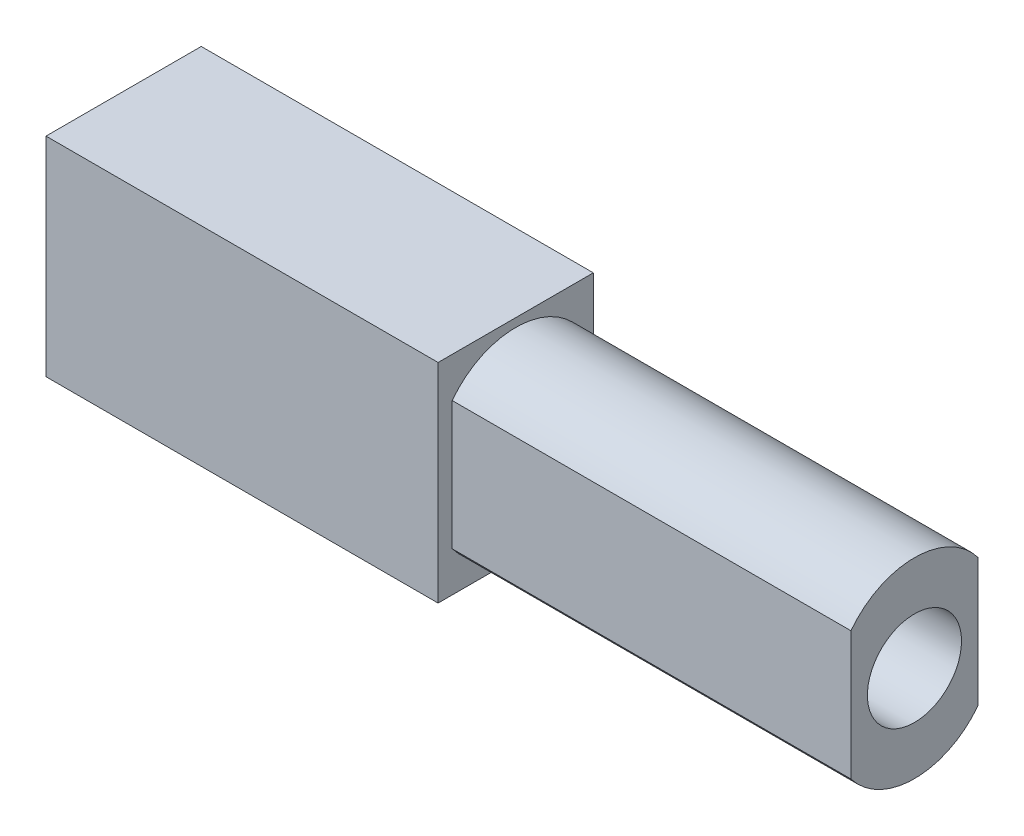
ISO-10303-21;
HEADER;
FILE_DESCRIPTION(('STEP AP214'),'2;1');
FILE_NAME('part.step','',(''),(''),'','','');
FILE_SCHEMA(('AUTOMOTIVE_DESIGN { 1 0 10303 214 1 1 1 1 }'));
ENDSEC;
DATA;
#1=APPLICATION_CONTEXT('core data for automotive mechanical design processes');
#2=APPLICATION_PROTOCOL_DEFINITION('international standard','automotive_design',2000,#1);
#3=PRODUCT_CONTEXT('',#1,'mechanical');
#4=PRODUCT('Part','Part','',(#3));
#5=PRODUCT_RELATED_PRODUCT_CATEGORY('part','',(#4));
#6=PRODUCT_DEFINITION_FORMATION('','',#4);
#7=PRODUCT_DEFINITION_CONTEXT('part definition',#1,'design');
#8=PRODUCT_DEFINITION('design','',#6,#7);
#9=PRODUCT_DEFINITION_SHAPE('','',#8);
#10=(LENGTH_UNIT() NAMED_UNIT(*) SI_UNIT(.MILLI.,.METRE.));
#11=(NAMED_UNIT(*) PLANE_ANGLE_UNIT() SI_UNIT($,.RADIAN.));
#12=(NAMED_UNIT(*) SI_UNIT($,.STERADIAN.) SOLID_ANGLE_UNIT());
#13=UNCERTAINTY_MEASURE_WITH_UNIT(LENGTH_MEASURE(1.E-05),#10,'distance_accuracy_value','');
#14=(GEOMETRIC_REPRESENTATION_CONTEXT(3) GLOBAL_UNCERTAINTY_ASSIGNED_CONTEXT((#13)) GLOBAL_UNIT_ASSIGNED_CONTEXT((#10,
#11,#12)) REPRESENTATION_CONTEXT('',''));
#15=CARTESIAN_POINT('',(0.,0.,0.));
#16=DIRECTION('',(0.,0.,1.));
#17=DIRECTION('',(1.,0.,0.));
#18=AXIS2_PLACEMENT_3D('',#15,#16,#17);
#19=CARTESIAN_POINT('',(38.1,6.1341,6.0706));
#20=DIRECTION('',(0.,0.,-1.));
#21=DIRECTION('',(0.,1.,0.));
#22=AXIS2_PLACEMENT_3D('',#19,#20,#21);
#23=PLANE('',#22);
#24=DIRECTION('',(0.,-1.,0.));
#25=VECTOR('',#24,1.);
#26=CARTESIAN_POINT('',(0.,6.1341,6.0706));
#27=LINE('',#26,#25);
#28=CARTESIAN_POINT('',(0.,6.1341,6.0706));
#29=VERTEX_POINT('',#28);
#30=CARTESIAN_POINT('',(0.,-6.1341,6.0706));
#31=VERTEX_POINT('',#30);
#32=EDGE_CURVE('E129',#29,#31,#27,.T.);
#33=ORIENTED_EDGE('',*,*,#32,.T.);
#34=DIRECTION('',(-1.,0.,0.));
#35=VECTOR('',#34,1.);
#36=CARTESIAN_POINT('',(38.1,-6.1341,6.0706));
#37=LINE('',#36,#35);
#38=CARTESIAN_POINT('',(38.1,-6.1341,6.0706));
#39=VERTEX_POINT('',#38);
#40=EDGE_CURVE('E11',#39,#31,#37,.T.);
#41=ORIENTED_EDGE('',*,*,#40,.F.);
#42=DIRECTION('',(0.,-1.,0.));
#43=VECTOR('',#42,1.);
#44=CARTESIAN_POINT('',(38.1,6.1341,6.0706));
#45=LINE('',#44,#43);
#46=CARTESIAN_POINT('',(38.1,6.1341,6.0706));
#47=VERTEX_POINT('',#46);
#48=EDGE_CURVE('E131',#47,#39,#45,.T.);
#49=ORIENTED_EDGE('',*,*,#48,.F.);
#50=DIRECTION('',(-1.,0.,0.));
#51=VECTOR('',#50,1.);
#52=CARTESIAN_POINT('',(38.1,6.1341,6.0706));
#53=LINE('',#52,#51);
#54=EDGE_CURVE('E48',#47,#29,#53,.T.);
#55=ORIENTED_EDGE('',*,*,#54,.T.);
#56=EDGE_LOOP('',(#33,#41,#49,#55));
#57=FACE_BOUND('',#56,.T.);
#58=ADVANCED_FACE('F33',(#57),#23,.F.);
#59=CARTESIAN_POINT('',(38.1,-1.52842788401085,0.));
#60=DIRECTION('',(-1.,0.,0.));
#61=DIRECTION('',(0.,0.,1.));
#62=AXIS2_PLACEMENT_3D('',#59,#60,#61);
#63=CYLINDRICAL_SURFACE('',#62,7.62);
#64=CARTESIAN_POINT('',(0.,-1.52842788401085,0.));
#65=DIRECTION('',(1.,0.,0.));
#66=DIRECTION('',(0.,0.,-1.));
#67=AXIS2_PLACEMENT_3D('',#64,#65,#66);
#68=CIRCLE('',#67,7.62);
#69=CARTESIAN_POINT('',(0.,-6.13409999999999,-6.0706));
#70=VERTEX_POINT('',#69);
#71=EDGE_CURVE('E144',#31,#70,#68,.T.);
#72=ORIENTED_EDGE('',*,*,#71,.T.);
#73=DIRECTION('',(-1.,0.,0.));
#74=VECTOR('',#73,1.);
#75=CARTESIAN_POINT('',(38.1,-6.13409999999999,-6.0706));
#76=LINE('',#75,#74);
#77=CARTESIAN_POINT('',(38.1,-6.13409999999999,-6.0706));
#78=VERTEX_POINT('',#77);
#79=EDGE_CURVE('E41',#78,#70,#76,.T.);
#80=ORIENTED_EDGE('',*,*,#79,.F.);
#81=CARTESIAN_POINT('',(38.1,-1.52842788401085,0.));
#82=DIRECTION('',(1.,0.,0.));
#83=DIRECTION('',(0.,0.,-1.));
#84=AXIS2_PLACEMENT_3D('',#81,#82,#83);
#85=CIRCLE('',#84,7.62);
#86=EDGE_CURVE('E134',#39,#78,#85,.T.);
#87=ORIENTED_EDGE('',*,*,#86,.F.);
#88=ORIENTED_EDGE('',*,*,#40,.T.);
#89=EDGE_LOOP('',(#72,#80,#87,#88));
#90=FACE_BOUND('',#89,.T.);
#91=ADVANCED_FACE('F161',(#90),#63,.T.);
#92=CARTESIAN_POINT('',(38.1,6.1341,-6.0706));
#93=DIRECTION('',(0.,0.,-1.));
#94=DIRECTION('',(0.,1.,0.));
#95=AXIS2_PLACEMENT_3D('',#92,#93,#94);
#96=PLANE('',#95);
#97=DIRECTION('',(0.,-1.,0.));
#98=VECTOR('',#97,1.);
#99=CARTESIAN_POINT('',(0.,6.1341,-6.0706));
#100=LINE('',#99,#98);
#101=CARTESIAN_POINT('',(0.,6.13410000000001,-6.0706));
#102=VERTEX_POINT('',#101);
#103=EDGE_CURVE('E147',#102,#70,#100,.T.);
#104=ORIENTED_EDGE('',*,*,#103,.F.);
#105=DIRECTION('',(-1.,0.,0.));
#106=VECTOR('',#105,1.);
#107=CARTESIAN_POINT('',(38.1,6.13410000000001,-6.0706));
#108=LINE('',#107,#106);
#109=CARTESIAN_POINT('',(38.1,6.13410000000001,-6.0706));
#110=VERTEX_POINT('',#109);
#111=EDGE_CURVE('E152',#110,#102,#108,.T.);
#112=ORIENTED_EDGE('',*,*,#111,.F.);
#113=DIRECTION('',(0.,-1.,0.));
#114=VECTOR('',#113,1.);
#115=CARTESIAN_POINT('',(38.1,6.1341,-6.0706));
#116=LINE('',#115,#114);
#117=EDGE_CURVE('E137',#110,#78,#116,.T.);
#118=ORIENTED_EDGE('',*,*,#117,.T.);
#119=ORIENTED_EDGE('',*,*,#79,.T.);
#120=EDGE_LOOP('',(#104,#112,#118,#119));
#121=FACE_BOUND('',#120,.T.);
#122=ADVANCED_FACE('F158',(#121),#96,.T.);
#123=CARTESIAN_POINT('',(38.1,1.52842788401085,0.));
#124=DIRECTION('',(-1.,0.,0.));
#125=DIRECTION('',(0.,0.,1.));
#126=AXIS2_PLACEMENT_3D('',#123,#124,#125);
#127=CYLINDRICAL_SURFACE('',#126,7.62);
#128=CARTESIAN_POINT('',(0.,1.52842788401085,0.));
#129=DIRECTION('',(-1.,0.,0.));
#130=DIRECTION('',(0.,0.,1.));
#131=AXIS2_PLACEMENT_3D('',#128,#129,#130);
#132=CIRCLE('',#131,7.62);
#133=EDGE_CURVE('E135',#29,#102,#132,.T.);
#134=ORIENTED_EDGE('',*,*,#133,.F.);
#135=ORIENTED_EDGE('',*,*,#54,.F.);
#136=CARTESIAN_POINT('',(38.1,1.52842788401085,0.));
#137=DIRECTION('',(-1.,0.,0.));
#138=DIRECTION('',(0.,0.,1.));
#139=AXIS2_PLACEMENT_3D('',#136,#137,#138);
#140=CIRCLE('',#139,7.62);
#141=EDGE_CURVE('E140',#47,#110,#140,.T.);
#142=ORIENTED_EDGE('',*,*,#141,.T.);
#143=ORIENTED_EDGE('',*,*,#111,.T.);
#144=EDGE_LOOP('',(#134,#135,#142,#143));
#145=FACE_BOUND('',#144,.T.);
#146=ADVANCED_FACE('F166',(#145),#127,.T.);
#147=CARTESIAN_POINT('',(38.1,-1.52842788401085,0.));
#148=DIRECTION('',(1.,0.,0.));
#149=DIRECTION('',(0.,0.,-1.));
#150=AXIS2_PLACEMENT_3D('',#147,#148,#149);
#151=PLANE('',#150);
#152=CARTESIAN_POINT('',(38.1,0.,0.));
#153=DIRECTION('',(1.,0.,0.));
#154=DIRECTION('',(0.,0.,-1.));
#155=AXIS2_PLACEMENT_3D('',#152,#153,#154);
#156=CIRCLE('',#155,4.4958);
#157=CARTESIAN_POINT('',(38.1,0.,-4.4958));
#158=VERTEX_POINT('',#157);
#159=EDGE_CURVE('E119',#158,#158,#156,.T.);
#160=ORIENTED_EDGE('',*,*,#159,.F.);
#161=EDGE_LOOP('',(#160));
#162=FACE_BOUND('',#161,.T.);
#163=ORIENTED_EDGE('',*,*,#48,.T.);
#164=ORIENTED_EDGE('',*,*,#86,.T.);
#165=ORIENTED_EDGE('',*,*,#117,.F.);
#166=ORIENTED_EDGE('',*,*,#141,.F.);
#167=EDGE_LOOP('',(#163,#164,#165,#166));
#168=FACE_BOUND('',#167,.T.);
#169=ADVANCED_FACE('F169',(#162,#168),#151,.T.);
#170=CARTESIAN_POINT('',(12.7,0.,0.));
#171=DIRECTION('',(1.,0.,0.));
#172=DIRECTION('',(0.,0.,-1.));
#173=AXIS2_PLACEMENT_3D('',#170,#171,#172);
#174=CYLINDRICAL_SURFACE('',#173,4.4958);
#175=CARTESIAN_POINT('',(12.7,0.,0.));
#176=DIRECTION('',(1.,0.,0.));
#177=DIRECTION('',(0.,0.,-1.));
#178=AXIS2_PLACEMENT_3D('',#175,#176,#177);
#179=CIRCLE('',#178,4.4958);
#180=CARTESIAN_POINT('',(12.7,0.,-4.4958));
#181=VERTEX_POINT('',#180);
#182=EDGE_CURVE('E122',#181,#181,#179,.T.);
#183=ORIENTED_EDGE('',*,*,#182,.F.);
#184=EDGE_LOOP('',(#183));
#185=FACE_BOUND('',#184,.T.);
#186=ORIENTED_EDGE('',*,*,#159,.T.);
#187=EDGE_LOOP('',(#186));
#188=FACE_BOUND('',#187,.T.);
#189=ADVANCED_FACE('F184',(#185,#188),#174,.F.);
#190=CARTESIAN_POINT('',(12.7,0.,0.));
#191=DIRECTION('',(1.,0.,0.));
#192=DIRECTION('',(0.,0.,-1.));
#193=AXIS2_PLACEMENT_3D('',#190,#191,#192);
#194=PLANE('',#193);
#195=ORIENTED_EDGE('',*,*,#182,.T.);
#196=EDGE_LOOP('',(#195));
#197=FACE_BOUND('',#196,.T.);
#198=ADVANCED_FACE('F188',(#197),#194,.T.);
#199=CARTESIAN_POINT('',(-37.465,-9.9568,7.4168));
#200=DIRECTION('',(0.,0.,-1.));
#201=DIRECTION('',(-1.,0.,0.));
#202=AXIS2_PLACEMENT_3D('',#199,#200,#201);
#203=PLANE('',#202);
#204=DIRECTION('',(0.,1.,0.));
#205=VECTOR('',#204,1.);
#206=CARTESIAN_POINT('',(0.,-9.9568,7.4168));
#207=LINE('',#206,#205);
#208=CARTESIAN_POINT('',(0.,-9.9568,7.4168));
#209=VERTEX_POINT('',#208);
#210=CARTESIAN_POINT('',(0.,9.9568,7.4168));
#211=VERTEX_POINT('',#210);
#212=EDGE_CURVE('E118',#209,#211,#207,.T.);
#213=ORIENTED_EDGE('',*,*,#212,.T.);
#214=DIRECTION('',(1.,0.,0.));
#215=VECTOR('',#214,1.);
#216=CARTESIAN_POINT('',(-37.465,9.9568,7.4168));
#217=LINE('',#216,#215);
#218=CARTESIAN_POINT('',(-37.465,9.9568,7.4168));
#219=VERTEX_POINT('',#218);
#220=EDGE_CURVE('E98',#219,#211,#217,.T.);
#221=ORIENTED_EDGE('',*,*,#220,.F.);
#222=DIRECTION('',(0.,1.,0.));
#223=VECTOR('',#222,1.);
#224=CARTESIAN_POINT('',(-37.465,-9.9568,7.4168));
#225=LINE('',#224,#223);
#226=CARTESIAN_POINT('',(-37.465,-9.9568,7.4168));
#227=VERTEX_POINT('',#226);
#228=EDGE_CURVE('E105',#227,#219,#225,.T.);
#229=ORIENTED_EDGE('',*,*,#228,.F.);
#230=DIRECTION('',(1.,0.,0.));
#231=VECTOR('',#230,1.);
#232=CARTESIAN_POINT('',(-37.465,-9.9568,7.4168));
#233=LINE('',#232,#231);
#234=EDGE_CURVE('E284',#227,#209,#233,.T.);
#235=ORIENTED_EDGE('',*,*,#234,.T.);
#236=EDGE_LOOP('',(#213,#221,#229,#235));
#237=FACE_BOUND('',#236,.T.);
#238=ADVANCED_FACE('F116',(#237),#203,.F.);
#239=CARTESIAN_POINT('',(-37.465,9.9568,-7.4168));
#240=DIRECTION('',(0.,-1.,0.));
#241=DIRECTION('',(0.,0.,-1.));
#242=AXIS2_PLACEMENT_3D('',#239,#240,#241);
#243=PLANE('',#242);
#244=DIRECTION('',(0.,0.,-1.));
#245=VECTOR('',#244,1.);
#246=CARTESIAN_POINT('',(0.,9.9568,-7.4168));
#247=LINE('',#246,#245);
#248=CARTESIAN_POINT('',(0.,9.9568,-7.4168));
#249=VERTEX_POINT('',#248);
#250=EDGE_CURVE('E290',#211,#249,#247,.T.);
#251=ORIENTED_EDGE('',*,*,#250,.T.);
#252=DIRECTION('',(1.,0.,0.));
#253=VECTOR('',#252,1.);
#254=CARTESIAN_POINT('',(-37.465,9.9568,-7.4168));
#255=LINE('',#254,#253);
#256=CARTESIAN_POINT('',(-37.465,9.9568,-7.4168));
#257=VERTEX_POINT('',#256);
#258=EDGE_CURVE('E101',#257,#249,#255,.T.);
#259=ORIENTED_EDGE('',*,*,#258,.F.);
#260=DIRECTION('',(0.,0.,-1.));
#261=VECTOR('',#260,1.);
#262=CARTESIAN_POINT('',(-37.465,9.9568,-7.4168));
#263=LINE('',#262,#261);
#264=EDGE_CURVE('E94',#219,#257,#263,.T.);
#265=ORIENTED_EDGE('',*,*,#264,.F.);
#266=ORIENTED_EDGE('',*,*,#220,.T.);
#267=EDGE_LOOP('',(#251,#259,#265,#266));
#268=FACE_BOUND('',#267,.T.);
#269=ADVANCED_FACE('F96',(#268),#243,.F.);
#270=CARTESIAN_POINT('',(-37.465,-9.9568,-7.4168));
#271=DIRECTION('',(0.,0.,1.));
#272=DIRECTION('',(1.,0.,0.));
#273=AXIS2_PLACEMENT_3D('',#270,#271,#272);
#274=PLANE('',#273);
#275=DIRECTION('',(0.,-1.,0.));
#276=VECTOR('',#275,1.);
#277=CARTESIAN_POINT('',(0.,-9.9568,-7.4168));
#278=LINE('',#277,#276);
#279=CARTESIAN_POINT('',(0.,-9.9568,-7.4168));
#280=VERTEX_POINT('',#279);
#281=EDGE_CURVE('E287',#249,#280,#278,.T.);
#282=ORIENTED_EDGE('',*,*,#281,.T.);
#283=DIRECTION('',(1.,0.,0.));
#284=VECTOR('',#283,1.);
#285=CARTESIAN_POINT('',(-37.465,-9.9568,-7.4168));
#286=LINE('',#285,#284);
#287=CARTESIAN_POINT('',(-37.465,-9.9568,-7.4168));
#288=VERTEX_POINT('',#287);
#289=EDGE_CURVE('E124',#288,#280,#286,.T.);
#290=ORIENTED_EDGE('',*,*,#289,.F.);
#291=DIRECTION('',(0.,-1.,0.));
#292=VECTOR('',#291,1.);
#293=CARTESIAN_POINT('',(-37.465,-9.9568,-7.4168));
#294=LINE('',#293,#292);
#295=EDGE_CURVE('E104',#257,#288,#294,.T.);
#296=ORIENTED_EDGE('',*,*,#295,.F.);
#297=ORIENTED_EDGE('',*,*,#258,.T.);
#298=EDGE_LOOP('',(#282,#290,#296,#297));
#299=FACE_BOUND('',#298,.T.);
#300=ADVANCED_FACE('F197',(#299),#274,.F.);
#301=CARTESIAN_POINT('',(-37.465,-9.9568,-7.4168));
#302=DIRECTION('',(0.,1.,0.));
#303=DIRECTION('',(0.,0.,1.));
#304=AXIS2_PLACEMENT_3D('',#301,#302,#303);
#305=PLANE('',#304);
#306=DIRECTION('',(0.,0.,1.));
#307=VECTOR('',#306,1.);
#308=CARTESIAN_POINT('',(0.,-9.9568,-7.4168));
#309=LINE('',#308,#307);
#310=EDGE_CURVE('E114',#280,#209,#309,.T.);
#311=ORIENTED_EDGE('',*,*,#310,.T.);
#312=ORIENTED_EDGE('',*,*,#234,.F.);
#313=DIRECTION('',(0.,0.,1.));
#314=VECTOR('',#313,1.);
#315=CARTESIAN_POINT('',(-37.465,-9.9568,-7.4168));
#316=LINE('',#315,#314);
#317=EDGE_CURVE('E110',#288,#227,#316,.T.);
#318=ORIENTED_EDGE('',*,*,#317,.F.);
#319=ORIENTED_EDGE('',*,*,#289,.T.);
#320=EDGE_LOOP('',(#311,#312,#318,#319));
#321=FACE_BOUND('',#320,.T.);
#322=ADVANCED_FACE('F200',(#321),#305,.F.);
#323=CARTESIAN_POINT('',(-37.465,0.,0.));
#324=DIRECTION('',(1.,0.,0.));
#325=DIRECTION('',(0.,0.,-1.));
#326=AXIS2_PLACEMENT_3D('',#323,#324,#325);
#327=PLANE('',#326);
#328=ORIENTED_EDGE('',*,*,#228,.T.);
#329=ORIENTED_EDGE('',*,*,#264,.T.);
#330=ORIENTED_EDGE('',*,*,#295,.T.);
#331=ORIENTED_EDGE('',*,*,#317,.T.);
#332=EDGE_LOOP('',(#328,#329,#330,#331));
#333=FACE_BOUND('',#332,.T.);
#334=ADVANCED_FACE('F108',(#333),#327,.F.);
#335=CARTESIAN_POINT('',(0.,0.,0.));
#336=DIRECTION('',(1.,0.,0.));
#337=DIRECTION('',(0.,0.,-1.));
#338=AXIS2_PLACEMENT_3D('',#335,#336,#337);
#339=PLANE('',#338);
#340=ORIENTED_EDGE('',*,*,#32,.F.);
#341=ORIENTED_EDGE('',*,*,#133,.T.);
#342=ORIENTED_EDGE('',*,*,#103,.T.);
#343=ORIENTED_EDGE('',*,*,#71,.F.);
#344=EDGE_LOOP('',(#340,#341,#342,#343));
#345=FACE_BOUND('',#344,.T.);
#346=ORIENTED_EDGE('',*,*,#212,.F.);
#347=ORIENTED_EDGE('',*,*,#310,.F.);
#348=ORIENTED_EDGE('',*,*,#281,.F.);
#349=ORIENTED_EDGE('',*,*,#250,.F.);
#350=EDGE_LOOP('',(#346,#347,#348,#349));
#351=FACE_BOUND('',#350,.T.);
#352=ADVANCED_FACE('F164',(#345,#351),#339,.T.);
#353=CLOSED_SHELL('',(#58,#91,#122,#146,#169,#189,#198,#238,#269,#300,#322,#334,#352));
#354=MANIFOLD_SOLID_BREP('B2',#353);
#355=ADVANCED_BREP_SHAPE_REPRESENTATION('',(#18,#354),#14);
#356=SHAPE_DEFINITION_REPRESENTATION(#9,#355);
ENDSEC;
END-ISO-10303-21;
